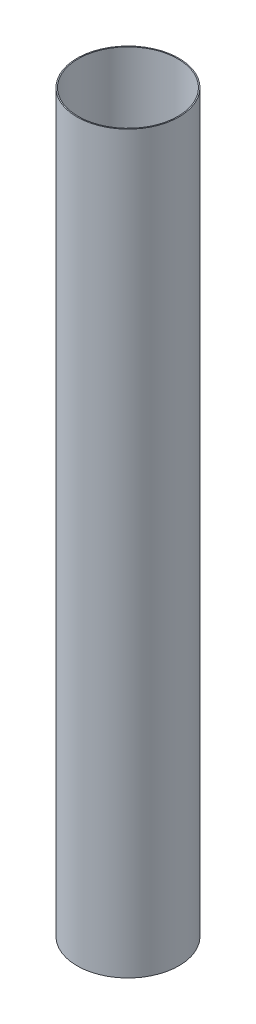
ISO-10303-21;
HEADER;
FILE_DESCRIPTION(('STEP AP214'),'2;1');
FILE_NAME('part.step','',(''),(''),'','','');
FILE_SCHEMA(('AUTOMOTIVE_DESIGN { 1 0 10303 214 1 1 1 1 }'));
ENDSEC;
DATA;
#1=APPLICATION_CONTEXT('core data for automotive mechanical design processes');
#2=APPLICATION_PROTOCOL_DEFINITION('international standard','automotive_design',2000,#1);
#3=PRODUCT_CONTEXT('',#1,'mechanical');
#4=PRODUCT('Part','Part','',(#3));
#5=PRODUCT_RELATED_PRODUCT_CATEGORY('part','',(#4));
#6=PRODUCT_DEFINITION_FORMATION('','',#4);
#7=PRODUCT_DEFINITION_CONTEXT('part definition',#1,'design');
#8=PRODUCT_DEFINITION('design','',#6,#7);
#9=PRODUCT_DEFINITION_SHAPE('','',#8);
#10=(LENGTH_UNIT() NAMED_UNIT(*) SI_UNIT(.MILLI.,.METRE.));
#11=(NAMED_UNIT(*) PLANE_ANGLE_UNIT() SI_UNIT($,.RADIAN.));
#12=(NAMED_UNIT(*) SI_UNIT($,.STERADIAN.) SOLID_ANGLE_UNIT());
#13=UNCERTAINTY_MEASURE_WITH_UNIT(LENGTH_MEASURE(1.E-05),#10,'distance_accuracy_value','');
#14=(GEOMETRIC_REPRESENTATION_CONTEXT(3) GLOBAL_UNCERTAINTY_ASSIGNED_CONTEXT((#13)) GLOBAL_UNIT_ASSIGNED_CONTEXT((#10,
#11,#12)) REPRESENTATION_CONTEXT('',''));
#15=CARTESIAN_POINT('',(0.,0.,0.));
#16=DIRECTION('',(0.,0.,1.));
#17=DIRECTION('',(1.,0.,0.));
#18=AXIS2_PLACEMENT_3D('',#15,#16,#17);
#19=CARTESIAN_POINT('',(0.,-711.2,0.));
#20=DIRECTION('',(0.,1.,0.));
#21=DIRECTION('',(0.,0.,1.));
#22=AXIS2_PLACEMENT_3D('',#19,#20,#21);
#23=CYLINDRICAL_SURFACE('',#22,49.276);
#24=CARTESIAN_POINT('',(0.,-711.2,0.));
#25=DIRECTION('',(0.,1.,0.));
#26=DIRECTION('',(0.,0.,1.));
#27=AXIS2_PLACEMENT_3D('',#24,#25,#26);
#28=CIRCLE('',#27,49.276);
#29=CARTESIAN_POINT('',(0.,-711.2,49.276));
#30=VERTEX_POINT('',#29);
#31=EDGE_CURVE('E10',#30,#30,#28,.T.);
#32=ORIENTED_EDGE('',*,*,#31,.T.);
#33=EDGE_LOOP('',(#32));
#34=FACE_BOUND('',#33,.T.);
#35=CARTESIAN_POINT('',(0.,0.,0.));
#36=DIRECTION('',(0.,1.,0.));
#37=DIRECTION('',(0.,0.,1.));
#38=AXIS2_PLACEMENT_3D('',#35,#36,#37);
#39=CIRCLE('',#38,49.276);
#40=CARTESIAN_POINT('',(0.,0.,49.276));
#41=VERTEX_POINT('',#40);
#42=EDGE_CURVE('E36',#41,#41,#39,.T.);
#43=ORIENTED_EDGE('',*,*,#42,.F.);
#44=EDGE_LOOP('',(#43));
#45=FACE_BOUND('',#44,.T.);
#46=ADVANCED_FACE('F33',(#34,#45),#23,.T.);
#47=CARTESIAN_POINT('',(0.,-711.2,0.));
#48=DIRECTION('',(0.,1.,0.));
#49=DIRECTION('',(0.,0.,1.));
#50=AXIS2_PLACEMENT_3D('',#47,#48,#49);
#51=PLANE('',#50);
#52=CARTESIAN_POINT('',(0.,-711.2,0.));
#53=DIRECTION('',(0.,1.,0.));
#54=DIRECTION('',(0.,0.,1.));
#55=AXIS2_PLACEMENT_3D('',#52,#53,#54);
#56=CIRCLE('',#55,48.26);
#57=CARTESIAN_POINT('',(0.,-711.2,48.26));
#58=VERTEX_POINT('',#57);
#59=EDGE_CURVE('E43',#58,#58,#56,.T.);
#60=ORIENTED_EDGE('',*,*,#59,.T.);
#61=EDGE_LOOP('',(#60));
#62=FACE_BOUND('',#61,.T.);
#63=ORIENTED_EDGE('',*,*,#31,.F.);
#64=EDGE_LOOP('',(#63));
#65=FACE_BOUND('',#64,.T.);
#66=ADVANCED_FACE('F51',(#62,#65),#51,.F.);
#67=CARTESIAN_POINT('',(0.,0.,0.));
#68=DIRECTION('',(0.,1.,0.));
#69=DIRECTION('',(0.,0.,1.));
#70=AXIS2_PLACEMENT_3D('',#67,#68,#69);
#71=PLANE('',#70);
#72=CARTESIAN_POINT('',(0.,0.,0.));
#73=DIRECTION('',(0.,1.,0.));
#74=DIRECTION('',(0.,0.,1.));
#75=AXIS2_PLACEMENT_3D('',#72,#73,#74);
#76=CIRCLE('',#75,48.26);
#77=CARTESIAN_POINT('',(0.,0.,48.26));
#78=VERTEX_POINT('',#77);
#79=EDGE_CURVE('E45',#78,#78,#76,.T.);
#80=ORIENTED_EDGE('',*,*,#79,.F.);
#81=EDGE_LOOP('',(#80));
#82=FACE_BOUND('',#81,.T.);
#83=ORIENTED_EDGE('',*,*,#42,.T.);
#84=EDGE_LOOP('',(#83));
#85=FACE_BOUND('',#84,.T.);
#86=ADVANCED_FACE('F57',(#82,#85),#71,.T.);
#87=CARTESIAN_POINT('',(0.,-711.2,0.));
#88=DIRECTION('',(0.,1.,0.));
#89=DIRECTION('',(0.,0.,1.));
#90=AXIS2_PLACEMENT_3D('',#87,#88,#89);
#91=CYLINDRICAL_SURFACE('',#90,48.26);
#92=ORIENTED_EDGE('',*,*,#59,.F.);
#93=EDGE_LOOP('',(#92));
#94=FACE_BOUND('',#93,.T.);
#95=ORIENTED_EDGE('',*,*,#79,.T.);
#96=EDGE_LOOP('',(#95));
#97=FACE_BOUND('',#96,.T.);
#98=ADVANCED_FACE('F54',(#94,#97),#91,.F.);
#99=CLOSED_SHELL('',(#46,#66,#86,#98));
#100=MANIFOLD_SOLID_BREP('B2',#99);
#101=ADVANCED_BREP_SHAPE_REPRESENTATION('',(#18,#100),#14);
#102=SHAPE_DEFINITION_REPRESENTATION(#9,#101);
ENDSEC;
END-ISO-10303-21;
